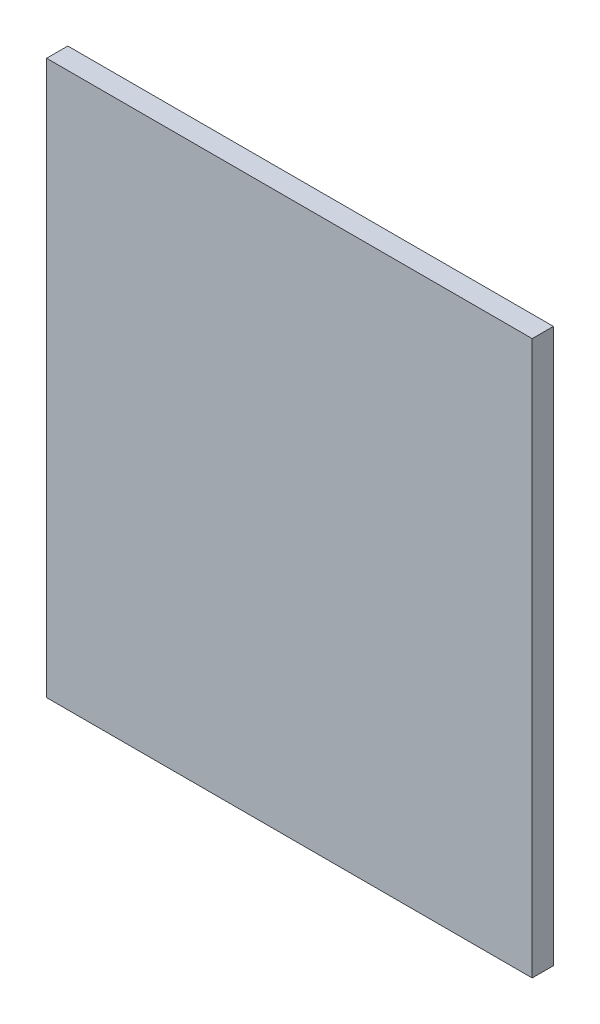
ISO-10303-21;
HEADER;
FILE_DESCRIPTION(('STEP AP214'),'2;1');
FILE_NAME('part.step','',(''),(''),'','','');
FILE_SCHEMA(('AUTOMOTIVE_DESIGN { 1 0 10303 214 1 1 1 1 }'));
ENDSEC;
DATA;
#1=APPLICATION_CONTEXT('core data for automotive mechanical design processes');
#2=APPLICATION_PROTOCOL_DEFINITION('international standard','automotive_design',2000,#1);
#3=PRODUCT_CONTEXT('',#1,'mechanical');
#4=PRODUCT('Part','Part','',(#3));
#5=PRODUCT_RELATED_PRODUCT_CATEGORY('part','',(#4));
#6=PRODUCT_DEFINITION_FORMATION('','',#4);
#7=PRODUCT_DEFINITION_CONTEXT('part definition',#1,'design');
#8=PRODUCT_DEFINITION('design','',#6,#7);
#9=PRODUCT_DEFINITION_SHAPE('','',#8);
#10=(LENGTH_UNIT() NAMED_UNIT(*) SI_UNIT(.MILLI.,.METRE.));
#11=(NAMED_UNIT(*) PLANE_ANGLE_UNIT() SI_UNIT($,.RADIAN.));
#12=(NAMED_UNIT(*) SI_UNIT($,.STERADIAN.) SOLID_ANGLE_UNIT());
#13=UNCERTAINTY_MEASURE_WITH_UNIT(LENGTH_MEASURE(1.E-05),#10,'distance_accuracy_value','');
#14=(GEOMETRIC_REPRESENTATION_CONTEXT(3) GLOBAL_UNCERTAINTY_ASSIGNED_CONTEXT((#13)) GLOBAL_UNIT_ASSIGNED_CONTEXT((#10,
#11,#12)) REPRESENTATION_CONTEXT('',''));
#15=CARTESIAN_POINT('',(0.,0.,0.));
#16=DIRECTION('',(0.,0.,1.));
#17=DIRECTION('',(1.,0.,0.));
#18=AXIS2_PLACEMENT_3D('',#15,#16,#17);
#19=CARTESIAN_POINT('',(-50.3819975019373,24.8,-13.3131100881137));
#20=DIRECTION('',(1.,0.,0.));
#21=DIRECTION('',(0.,0.,-1.));
#22=AXIS2_PLACEMENT_3D('',#19,#20,#21);
#23=PLANE('',#22);
#24=DIRECTION('',(0.,0.,1.));
#25=VECTOR('',#24,1.);
#26=CARTESIAN_POINT('',(-50.3819975019373,0.,-13.3131100881137));
#27=LINE('',#26,#25);
#28=CARTESIAN_POINT('',(-50.3819975019373,0.,-13.3131100881137));
#29=VERTEX_POINT('',#28);
#30=CARTESIAN_POINT('',(-50.3819975019373,0.,-12.3631100881137));
#31=VERTEX_POINT('',#30);
#32=EDGE_CURVE('E113',#29,#31,#27,.T.);
#33=ORIENTED_EDGE('',*,*,#32,.T.);
#34=DIRECTION('',(0.,-1.,0.));
#35=VECTOR('',#34,1.);
#36=CARTESIAN_POINT('',(-50.3819975019373,24.8,-12.3631100881137));
#37=LINE('',#36,#35);
#38=CARTESIAN_POINT('',(-50.3819975019373,24.8,-12.3631100881137));
#39=VERTEX_POINT('',#38);
#40=EDGE_CURVE('E11',#39,#31,#37,.T.);
#41=ORIENTED_EDGE('',*,*,#40,.F.);
#42=DIRECTION('',(0.,0.,1.));
#43=VECTOR('',#42,1.);
#44=CARTESIAN_POINT('',(-50.3819975019373,24.8,-13.3131100881137));
#45=LINE('',#44,#43);
#46=CARTESIAN_POINT('',(-50.3819975019373,24.8,-13.3131100881137));
#47=VERTEX_POINT('',#46);
#48=EDGE_CURVE('E97',#47,#39,#45,.T.);
#49=ORIENTED_EDGE('',*,*,#48,.F.);
#50=DIRECTION('',(0.,-1.,0.));
#51=VECTOR('',#50,1.);
#52=CARTESIAN_POINT('',(-50.3819975019373,24.8,-13.3131100881137));
#53=LINE('',#52,#51);
#54=EDGE_CURVE('E109',#47,#29,#53,.T.);
#55=ORIENTED_EDGE('',*,*,#54,.T.);
#56=EDGE_LOOP('',(#33,#41,#49,#55));
#57=FACE_BOUND('',#56,.T.);
#58=ADVANCED_FACE('F45',(#57),#23,.F.);
#59=CARTESIAN_POINT('',(-50.3819975019373,24.8,-12.3631100881137));
#60=DIRECTION('',(0.,0.,-1.));
#61=DIRECTION('',(-1.,0.,0.));
#62=AXIS2_PLACEMENT_3D('',#59,#60,#61);
#63=PLANE('',#62);
#64=DIRECTION('',(1.,0.,0.));
#65=VECTOR('',#64,1.);
#66=CARTESIAN_POINT('',(-50.3819975019373,0.,-12.3631100881137));
#67=LINE('',#66,#65);
#68=CARTESIAN_POINT('',(-28.6319975019373,0.,-12.3631100881137));
#69=VERTEX_POINT('',#68);
#70=EDGE_CURVE('E102',#31,#69,#67,.T.);
#71=ORIENTED_EDGE('',*,*,#70,.T.);
#72=DIRECTION('',(0.,-1.,0.));
#73=VECTOR('',#72,1.);
#74=CARTESIAN_POINT('',(-28.6319975019373,24.8,-12.3631100881137));
#75=LINE('',#74,#73);
#76=CARTESIAN_POINT('',(-28.6319975019373,24.8,-12.3631100881137));
#77=VERTEX_POINT('',#76);
#78=EDGE_CURVE('E54',#77,#69,#75,.T.);
#79=ORIENTED_EDGE('',*,*,#78,.F.);
#80=DIRECTION('',(1.,0.,0.));
#81=VECTOR('',#80,1.);
#82=CARTESIAN_POINT('',(-50.3819975019373,24.8,-12.3631100881137));
#83=LINE('',#82,#81);
#84=EDGE_CURVE('E92',#39,#77,#83,.T.);
#85=ORIENTED_EDGE('',*,*,#84,.F.);
#86=ORIENTED_EDGE('',*,*,#40,.T.);
#87=EDGE_LOOP('',(#71,#79,#85,#86));
#88=FACE_BOUND('',#87,.T.);
#89=ADVANCED_FACE('F101',(#88),#63,.F.);
#90=CARTESIAN_POINT('',(-28.6319975019373,24.8,-13.3131100881137));
#91=DIRECTION('',(-1.,0.,0.));
#92=DIRECTION('',(0.,0.,1.));
#93=AXIS2_PLACEMENT_3D('',#90,#91,#92);
#94=PLANE('',#93);
#95=DIRECTION('',(0.,0.,-1.));
#96=VECTOR('',#95,1.);
#97=CARTESIAN_POINT('',(-28.6319975019373,0.,-13.3131100881137));
#98=LINE('',#97,#96);
#99=CARTESIAN_POINT('',(-28.6319975019373,0.,-13.3131100881137));
#100=VERTEX_POINT('',#99);
#101=EDGE_CURVE('E79',#69,#100,#98,.T.);
#102=ORIENTED_EDGE('',*,*,#101,.T.);
#103=DIRECTION('',(0.,-1.,0.));
#104=VECTOR('',#103,1.);
#105=CARTESIAN_POINT('',(-28.6319975019373,24.8,-13.3131100881137));
#106=LINE('',#105,#104);
#107=CARTESIAN_POINT('',(-28.6319975019373,24.8,-13.3131100881137));
#108=VERTEX_POINT('',#107);
#109=EDGE_CURVE('E104',#108,#100,#106,.T.);
#110=ORIENTED_EDGE('',*,*,#109,.F.);
#111=DIRECTION('',(0.,0.,-1.));
#112=VECTOR('',#111,1.);
#113=CARTESIAN_POINT('',(-28.6319975019373,24.8,-13.3131100881137));
#114=LINE('',#113,#112);
#115=EDGE_CURVE('E95',#77,#108,#114,.T.);
#116=ORIENTED_EDGE('',*,*,#115,.F.);
#117=ORIENTED_EDGE('',*,*,#78,.T.);
#118=EDGE_LOOP('',(#102,#110,#116,#117));
#119=FACE_BOUND('',#118,.T.);
#120=ADVANCED_FACE('F105',(#119),#94,.F.);
#121=CARTESIAN_POINT('',(-50.3819975019373,24.8,-13.3131100881137));
#122=DIRECTION('',(0.,0.,1.));
#123=DIRECTION('',(1.,0.,0.));
#124=AXIS2_PLACEMENT_3D('',#121,#122,#123);
#125=PLANE('',#124);
#126=DIRECTION('',(-1.,0.,0.));
#127=VECTOR('',#126,1.);
#128=CARTESIAN_POINT('',(-50.3819975019373,0.,-13.3131100881137));
#129=LINE('',#128,#127);
#130=EDGE_CURVE('E85',#100,#29,#129,.T.);
#131=ORIENTED_EDGE('',*,*,#130,.T.);
#132=ORIENTED_EDGE('',*,*,#54,.F.);
#133=DIRECTION('',(-1.,0.,0.));
#134=VECTOR('',#133,1.);
#135=CARTESIAN_POINT('',(-50.3819975019373,24.8,-13.3131100881137));
#136=LINE('',#135,#134);
#137=EDGE_CURVE('E62',#108,#47,#136,.T.);
#138=ORIENTED_EDGE('',*,*,#137,.F.);
#139=ORIENTED_EDGE('',*,*,#109,.T.);
#140=EDGE_LOOP('',(#131,#132,#138,#139));
#141=FACE_BOUND('',#140,.T.);
#142=ADVANCED_FACE('F126',(#141),#125,.F.);
#143=CARTESIAN_POINT('',(0.,24.8,0.));
#144=DIRECTION('',(0.,1.,0.));
#145=DIRECTION('',(0.,0.,1.));
#146=AXIS2_PLACEMENT_3D('',#143,#144,#145);
#147=PLANE('',#146);
#148=ORIENTED_EDGE('',*,*,#48,.T.);
#149=ORIENTED_EDGE('',*,*,#84,.T.);
#150=ORIENTED_EDGE('',*,*,#115,.T.);
#151=ORIENTED_EDGE('',*,*,#137,.T.);
#152=EDGE_LOOP('',(#148,#149,#150,#151));
#153=FACE_BOUND('',#152,.T.);
#154=ADVANCED_FACE('F93',(#153),#147,.T.);
#155=CARTESIAN_POINT('',(0.,0.,0.));
#156=DIRECTION('',(0.,1.,0.));
#157=DIRECTION('',(0.,0.,1.));
#158=AXIS2_PLACEMENT_3D('',#155,#156,#157);
#159=PLANE('',#158);
#160=ORIENTED_EDGE('',*,*,#32,.F.);
#161=ORIENTED_EDGE('',*,*,#130,.F.);
#162=ORIENTED_EDGE('',*,*,#101,.F.);
#163=ORIENTED_EDGE('',*,*,#70,.F.);
#164=EDGE_LOOP('',(#160,#161,#162,#163));
#165=FACE_BOUND('',#164,.T.);
#166=ADVANCED_FACE('F129',(#165),#159,.F.);
#167=CLOSED_SHELL('',(#58,#89,#120,#142,#154,#166));
#168=MANIFOLD_SOLID_BREP('B2',#167);
#169=ADVANCED_BREP_SHAPE_REPRESENTATION('',(#18,#168),#14);
#170=SHAPE_DEFINITION_REPRESENTATION(#9,#169);
ENDSEC;
END-ISO-10303-21;
